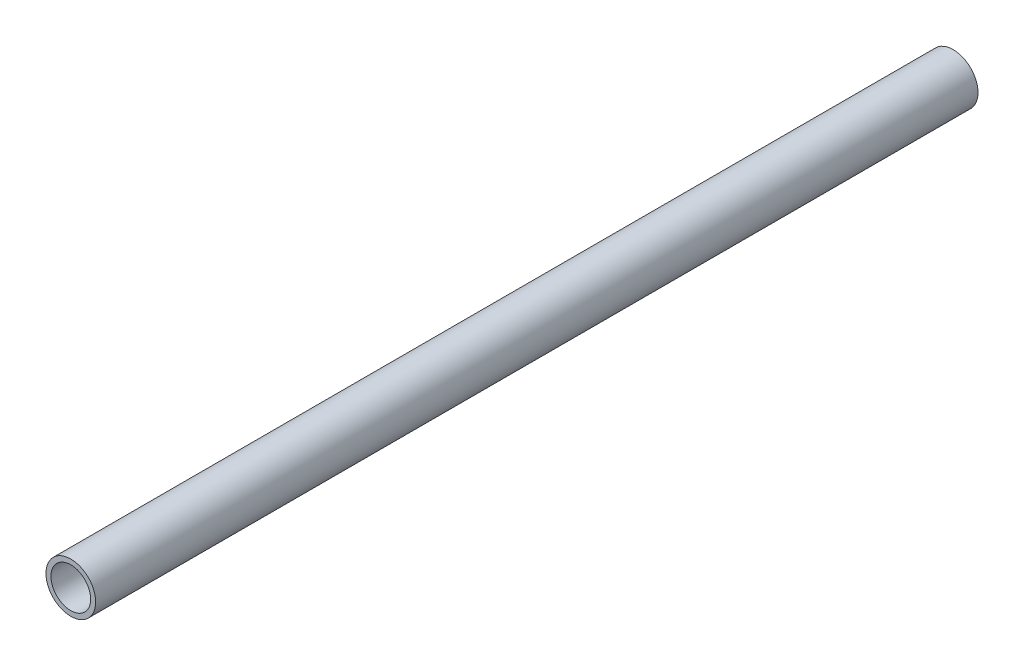
ISO-10303-21;
HEADER;
FILE_DESCRIPTION(('STEP AP214'),'2;1');
FILE_NAME('part.step','',(''),(''),'','','');
FILE_SCHEMA(('AUTOMOTIVE_DESIGN { 1 0 10303 214 1 1 1 1 }'));
ENDSEC;
DATA;
#1=APPLICATION_CONTEXT('core data for automotive mechanical design processes');
#2=APPLICATION_PROTOCOL_DEFINITION('international standard','automotive_design',2000,#1);
#3=PRODUCT_CONTEXT('',#1,'mechanical');
#4=PRODUCT('Part','Part','',(#3));
#5=PRODUCT_RELATED_PRODUCT_CATEGORY('part','',(#4));
#6=PRODUCT_DEFINITION_FORMATION('','',#4);
#7=PRODUCT_DEFINITION_CONTEXT('part definition',#1,'design');
#8=PRODUCT_DEFINITION('design','',#6,#7);
#9=PRODUCT_DEFINITION_SHAPE('','',#8);
#10=(LENGTH_UNIT() NAMED_UNIT(*) SI_UNIT(.MILLI.,.METRE.));
#11=(NAMED_UNIT(*) PLANE_ANGLE_UNIT() SI_UNIT($,.RADIAN.));
#12=(NAMED_UNIT(*) SI_UNIT($,.STERADIAN.) SOLID_ANGLE_UNIT());
#13=UNCERTAINTY_MEASURE_WITH_UNIT(LENGTH_MEASURE(1.E-05),#10,'distance_accuracy_value','');
#14=(GEOMETRIC_REPRESENTATION_CONTEXT(3) GLOBAL_UNCERTAINTY_ASSIGNED_CONTEXT((#13)) GLOBAL_UNIT_ASSIGNED_CONTEXT((#10,
#11,#12)) REPRESENTATION_CONTEXT('',''));
#15=CARTESIAN_POINT('',(0.,0.,0.));
#16=DIRECTION('',(0.,0.,1.));
#17=DIRECTION('',(1.,0.,0.));
#18=AXIS2_PLACEMENT_3D('',#15,#16,#17);
#19=CARTESIAN_POINT('',(0.,0.,177.65014));
#20=DIRECTION('',(0.,0.,1.));
#21=DIRECTION('',(1.,0.,0.));
#22=AXIS2_PLACEMENT_3D('',#19,#20,#21);
#23=PLANE('',#22);
#24=CARTESIAN_POINT('',(0.,0.,177.65014));
#25=DIRECTION('',(0.,0.,1.));
#26=DIRECTION('',(1.,0.,0.));
#27=AXIS2_PLACEMENT_3D('',#24,#25,#26);
#28=CIRCLE('',#27,5.);
#29=CARTESIAN_POINT('',(5.,0.,177.65014));
#30=VERTEX_POINT('',#29);
#31=EDGE_CURVE('E10',#30,#30,#28,.T.);
#32=ORIENTED_EDGE('',*,*,#31,.T.);
#33=EDGE_LOOP('',(#32));
#34=FACE_BOUND('',#33,.T.);
#35=CARTESIAN_POINT('',(0.,0.,177.65014));
#36=DIRECTION('',(0.,0.,1.));
#37=DIRECTION('',(1.,0.,0.));
#38=AXIS2_PLACEMENT_3D('',#35,#36,#37);
#39=CIRCLE('',#38,4.);
#40=CARTESIAN_POINT('',(4.,0.,177.65014));
#41=VERTEX_POINT('',#40);
#42=EDGE_CURVE('E50',#41,#41,#39,.T.);
#43=ORIENTED_EDGE('',*,*,#42,.F.);
#44=EDGE_LOOP('',(#43));
#45=FACE_BOUND('',#44,.T.);
#46=ADVANCED_FACE('F37',(#34,#45),#23,.T.);
#47=CARTESIAN_POINT('',(0.,0.,0.));
#48=DIRECTION('',(0.,0.,1.));
#49=DIRECTION('',(1.,0.,0.));
#50=AXIS2_PLACEMENT_3D('',#47,#48,#49);
#51=PLANE('',#50);
#52=CARTESIAN_POINT('',(0.,0.,0.));
#53=DIRECTION('',(0.,0.,1.));
#54=DIRECTION('',(1.,0.,0.));
#55=AXIS2_PLACEMENT_3D('',#52,#53,#54);
#56=CIRCLE('',#55,5.);
#57=CARTESIAN_POINT('',(5.,0.,0.));
#58=VERTEX_POINT('',#57);
#59=EDGE_CURVE('E41',#58,#58,#56,.T.);
#60=ORIENTED_EDGE('',*,*,#59,.F.);
#61=EDGE_LOOP('',(#60));
#62=FACE_BOUND('',#61,.T.);
#63=CARTESIAN_POINT('',(0.,0.,0.));
#64=DIRECTION('',(0.,0.,1.));
#65=DIRECTION('',(1.,0.,0.));
#66=AXIS2_PLACEMENT_3D('',#63,#64,#65);
#67=CIRCLE('',#66,4.);
#68=CARTESIAN_POINT('',(4.,0.,0.));
#69=VERTEX_POINT('',#68);
#70=EDGE_CURVE('E52',#69,#69,#67,.T.);
#71=ORIENTED_EDGE('',*,*,#70,.T.);
#72=EDGE_LOOP('',(#71));
#73=FACE_BOUND('',#72,.T.);
#74=ADVANCED_FACE('F64',(#62,#73),#51,.F.);
#75=CARTESIAN_POINT('',(0.,0.,177.65014));
#76=DIRECTION('',(0.,0.,-1.));
#77=DIRECTION('',(-1.,0.,0.));
#78=AXIS2_PLACEMENT_3D('',#75,#76,#77);
#79=CYLINDRICAL_SURFACE('',#78,5.);
#80=ORIENTED_EDGE('',*,*,#31,.F.);
#81=EDGE_LOOP('',(#80));
#82=FACE_BOUND('',#81,.T.);
#83=ORIENTED_EDGE('',*,*,#59,.T.);
#84=EDGE_LOOP('',(#83));
#85=FACE_BOUND('',#84,.T.);
#86=ADVANCED_FACE('F39',(#82,#85),#79,.T.);
#87=CARTESIAN_POINT('',(0.,0.,177.65014));
#88=DIRECTION('',(0.,0.,-1.));
#89=DIRECTION('',(-1.,0.,0.));
#90=AXIS2_PLACEMENT_3D('',#87,#88,#89);
#91=CYLINDRICAL_SURFACE('',#90,4.);
#92=ORIENTED_EDGE('',*,*,#42,.T.);
#93=EDGE_LOOP('',(#92));
#94=FACE_BOUND('',#93,.T.);
#95=ORIENTED_EDGE('',*,*,#70,.F.);
#96=EDGE_LOOP('',(#95));
#97=FACE_BOUND('',#96,.T.);
#98=ADVANCED_FACE('F60',(#94,#97),#91,.F.);
#99=CLOSED_SHELL('',(#46,#74,#86,#98));
#100=MANIFOLD_SOLID_BREP('B2',#99);
#101=ADVANCED_BREP_SHAPE_REPRESENTATION('',(#18,#100),#14);
#102=SHAPE_DEFINITION_REPRESENTATION(#9,#101);
ENDSEC;
END-ISO-10303-21;
